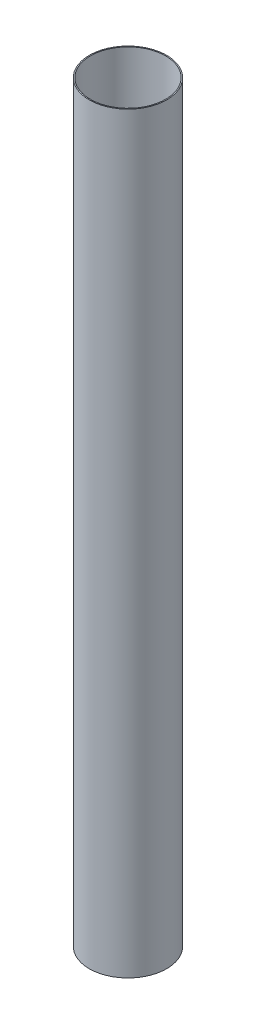
ISO-10303-21;
HEADER;
FILE_DESCRIPTION(('STEP AP214'),'2;1');
FILE_NAME('part.step','',(''),(''),'','','');
FILE_SCHEMA(('AUTOMOTIVE_DESIGN { 1 0 10303 214 1 1 1 1 }'));
ENDSEC;
DATA;
#1=APPLICATION_CONTEXT('core data for automotive mechanical design processes');
#2=APPLICATION_PROTOCOL_DEFINITION('international standard','automotive_design',2000,#1);
#3=PRODUCT_CONTEXT('',#1,'mechanical');
#4=PRODUCT('Part','Part','',(#3));
#5=PRODUCT_RELATED_PRODUCT_CATEGORY('part','',(#4));
#6=PRODUCT_DEFINITION_FORMATION('','',#4);
#7=PRODUCT_DEFINITION_CONTEXT('part definition',#1,'design');
#8=PRODUCT_DEFINITION('design','',#6,#7);
#9=PRODUCT_DEFINITION_SHAPE('','',#8);
#10=(LENGTH_UNIT() NAMED_UNIT(*) SI_UNIT(.MILLI.,.METRE.));
#11=(NAMED_UNIT(*) PLANE_ANGLE_UNIT() SI_UNIT($,.RADIAN.));
#12=(NAMED_UNIT(*) SI_UNIT($,.STERADIAN.) SOLID_ANGLE_UNIT());
#13=UNCERTAINTY_MEASURE_WITH_UNIT(LENGTH_MEASURE(1.E-05),#10,'distance_accuracy_value','');
#14=(GEOMETRIC_REPRESENTATION_CONTEXT(3) GLOBAL_UNCERTAINTY_ASSIGNED_CONTEXT((#13)) GLOBAL_UNIT_ASSIGNED_CONTEXT((#10,
#11,#12)) REPRESENTATION_CONTEXT('',''));
#15=CARTESIAN_POINT('',(0.,0.,0.));
#16=DIRECTION('',(0.,0.,1.));
#17=DIRECTION('',(1.,0.,0.));
#18=AXIS2_PLACEMENT_3D('',#15,#16,#17);
#19=CARTESIAN_POINT('',(0.,1524.,0.));
#20=DIRECTION('',(0.,1.,0.));
#21=DIRECTION('',(0.,0.,1.));
#22=AXIS2_PLACEMENT_3D('',#19,#20,#21);
#23=PLANE('',#22);
#24=CARTESIAN_POINT('',(0.,1524.,0.));
#25=DIRECTION('',(0.,1.,0.));
#26=DIRECTION('',(0.,0.,1.));
#27=AXIS2_PLACEMENT_3D('',#24,#25,#26);
#28=CIRCLE('',#27,78.359);
#29=CARTESIAN_POINT('',(0.,1524.,78.359));
#30=VERTEX_POINT('',#29);
#31=EDGE_CURVE('E10',#30,#30,#28,.T.);
#32=ORIENTED_EDGE('',*,*,#31,.T.);
#33=EDGE_LOOP('',(#32));
#34=FACE_BOUND('',#33,.T.);
#35=CARTESIAN_POINT('',(0.,1524.,0.));
#36=DIRECTION('',(0.,1.,0.));
#37=DIRECTION('',(0.,0.,1.));
#38=AXIS2_PLACEMENT_3D('',#35,#36,#37);
#39=CIRCLE('',#38,76.2);
#40=CARTESIAN_POINT('',(0.,1524.,76.2));
#41=VERTEX_POINT('',#40);
#42=EDGE_CURVE('E48',#41,#41,#39,.T.);
#43=ORIENTED_EDGE('',*,*,#42,.F.);
#44=EDGE_LOOP('',(#43));
#45=FACE_BOUND('',#44,.T.);
#46=ADVANCED_FACE('F37',(#34,#45),#23,.T.);
#47=CARTESIAN_POINT('',(0.,0.,0.));
#48=DIRECTION('',(0.,1.,0.));
#49=DIRECTION('',(0.,0.,1.));
#50=AXIS2_PLACEMENT_3D('',#47,#48,#49);
#51=PLANE('',#50);
#52=CARTESIAN_POINT('',(0.,0.,0.));
#53=DIRECTION('',(0.,1.,0.));
#54=DIRECTION('',(0.,0.,1.));
#55=AXIS2_PLACEMENT_3D('',#52,#53,#54);
#56=CIRCLE('',#55,78.359);
#57=CARTESIAN_POINT('',(0.,0.,78.359));
#58=VERTEX_POINT('',#57);
#59=EDGE_CURVE('E41',#58,#58,#56,.T.);
#60=ORIENTED_EDGE('',*,*,#59,.F.);
#61=EDGE_LOOP('',(#60));
#62=FACE_BOUND('',#61,.T.);
#63=CARTESIAN_POINT('',(0.,0.,0.));
#64=DIRECTION('',(0.,1.,0.));
#65=DIRECTION('',(0.,0.,1.));
#66=AXIS2_PLACEMENT_3D('',#63,#64,#65);
#67=CIRCLE('',#66,76.2);
#68=CARTESIAN_POINT('',(0.,0.,76.2));
#69=VERTEX_POINT('',#68);
#70=EDGE_CURVE('E50',#69,#69,#67,.T.);
#71=ORIENTED_EDGE('',*,*,#70,.T.);
#72=EDGE_LOOP('',(#71));
#73=FACE_BOUND('',#72,.T.);
#74=ADVANCED_FACE('F60',(#62,#73),#51,.F.);
#75=CARTESIAN_POINT('',(0.,1524.,0.));
#76=DIRECTION('',(0.,-1.,0.));
#77=DIRECTION('',(0.,0.,-1.));
#78=AXIS2_PLACEMENT_3D('',#75,#76,#77);
#79=CYLINDRICAL_SURFACE('',#78,78.359);
#80=ORIENTED_EDGE('',*,*,#31,.F.);
#81=EDGE_LOOP('',(#80));
#82=FACE_BOUND('',#81,.T.);
#83=ORIENTED_EDGE('',*,*,#59,.T.);
#84=EDGE_LOOP('',(#83));
#85=FACE_BOUND('',#84,.T.);
#86=ADVANCED_FACE('F39',(#82,#85),#79,.T.);
#87=CARTESIAN_POINT('',(0.,1524.,0.));
#88=DIRECTION('',(0.,-1.,0.));
#89=DIRECTION('',(0.,0.,-1.));
#90=AXIS2_PLACEMENT_3D('',#87,#88,#89);
#91=CYLINDRICAL_SURFACE('',#90,76.2);
#92=ORIENTED_EDGE('',*,*,#42,.T.);
#93=EDGE_LOOP('',(#92));
#94=FACE_BOUND('',#93,.T.);
#95=ORIENTED_EDGE('',*,*,#70,.F.);
#96=EDGE_LOOP('',(#95));
#97=FACE_BOUND('',#96,.T.);
#98=ADVANCED_FACE('F56',(#94,#97),#91,.F.);
#99=CLOSED_SHELL('',(#46,#74,#86,#98));
#100=MANIFOLD_SOLID_BREP('B2',#99);
#101=ADVANCED_BREP_SHAPE_REPRESENTATION('',(#18,#100),#14);
#102=SHAPE_DEFINITION_REPRESENTATION(#9,#101);
ENDSEC;
END-ISO-10303-21;
